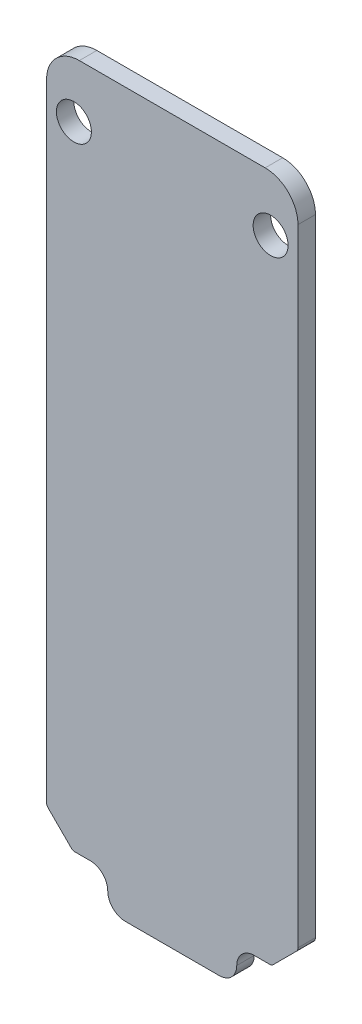
ISO-10303-21;
HEADER;
FILE_DESCRIPTION(('STEP AP214'),'2;1');
FILE_NAME('part.step','',(''),(''),'','','');
FILE_SCHEMA(('AUTOMOTIVE_DESIGN { 1 0 10303 214 1 1 1 1 }'));
ENDSEC;
DATA;
#1=APPLICATION_CONTEXT('core data for automotive mechanical design processes');
#2=APPLICATION_PROTOCOL_DEFINITION('international standard','automotive_design',2000,#1);
#3=PRODUCT_CONTEXT('',#1,'mechanical');
#4=PRODUCT('Part','Part','',(#3));
#5=PRODUCT_RELATED_PRODUCT_CATEGORY('part','',(#4));
#6=PRODUCT_DEFINITION_FORMATION('','',#4);
#7=PRODUCT_DEFINITION_CONTEXT('part definition',#1,'design');
#8=PRODUCT_DEFINITION('design','',#6,#7);
#9=PRODUCT_DEFINITION_SHAPE('','',#8);
#10=(LENGTH_UNIT() NAMED_UNIT(*) SI_UNIT(.MILLI.,.METRE.));
#11=(NAMED_UNIT(*) PLANE_ANGLE_UNIT() SI_UNIT($,.RADIAN.));
#12=(NAMED_UNIT(*) SI_UNIT($,.STERADIAN.) SOLID_ANGLE_UNIT());
#13=UNCERTAINTY_MEASURE_WITH_UNIT(LENGTH_MEASURE(1.E-05),#10,'distance_accuracy_value','');
#14=(GEOMETRIC_REPRESENTATION_CONTEXT(3) GLOBAL_UNCERTAINTY_ASSIGNED_CONTEXT((#13)) GLOBAL_UNIT_ASSIGNED_CONTEXT((#10,
#11,#12)) REPRESENTATION_CONTEXT('',''));
#15=CARTESIAN_POINT('',(0.,0.,0.));
#16=DIRECTION('',(0.,0.,1.));
#17=DIRECTION('',(1.,0.,0.));
#18=AXIS2_PLACEMENT_3D('',#15,#16,#17);
#19=CARTESIAN_POINT('',(-9.09999999999996,20.2,1.6));
#20=DIRECTION('',(0.707106781186547,0.707106781186548,0.));
#21=DIRECTION('',(-0.707106781186548,0.707106781186547,0.));
#22=AXIS2_PLACEMENT_3D('',#19,#20,#21);
#23=PLANE('',#22);
#24=DIRECTION('',(0.707106781186548,-0.707106781186547,0.));
#25=VECTOR('',#24,1.);
#26=CARTESIAN_POINT('',(-9.09999999999996,20.2,1.6));
#27=LINE('',#26,#25);
#28=CARTESIAN_POINT('',(-11.3535533905933,22.4535533905933,1.6));
#29=VERTEX_POINT('',#28);
#30=CARTESIAN_POINT('',(-9.24644660940669,20.3464466094067,1.6));
#31=VERTEX_POINT('',#30);
#32=EDGE_CURVE('E190',#29,#31,#27,.T.);
#33=ORIENTED_EDGE('',*,*,#32,.F.);
#34=DIRECTION('',(0.,0.,-1.));
#35=VECTOR('',#34,1.);
#36=CARTESIAN_POINT('',(-11.3535533905933,22.4535533905933,1.6));
#37=LINE('',#36,#35);
#38=CARTESIAN_POINT('',(-11.3535533905933,22.4535533905933,0.));
#39=VERTEX_POINT('',#38);
#40=EDGE_CURVE('E269',#29,#39,#37,.T.);
#41=ORIENTED_EDGE('',*,*,#40,.T.);
#42=DIRECTION('',(0.707106781186548,-0.707106781186547,0.));
#43=VECTOR('',#42,1.);
#44=CARTESIAN_POINT('',(-9.09999999999996,20.2,0.));
#45=LINE('',#44,#43);
#46=CARTESIAN_POINT('',(-9.24644660940669,20.3464466094067,0.));
#47=VERTEX_POINT('',#46);
#48=EDGE_CURVE('E239',#39,#47,#45,.T.);
#49=ORIENTED_EDGE('',*,*,#48,.T.);
#50=DIRECTION('',(0.,0.,-1.));
#51=VECTOR('',#50,1.);
#52=CARTESIAN_POINT('',(-9.24644660940669,20.3464466094067,1.6));
#53=LINE('',#52,#51);
#54=EDGE_CURVE('E49',#47,#31,#53,.F.);
#55=ORIENTED_EDGE('',*,*,#54,.T.);
#56=EDGE_LOOP('',(#33,#41,#49,#55));
#57=FACE_BOUND('',#56,.T.);
#58=ADVANCED_FACE('F34',(#57),#23,.F.);
#59=CARTESIAN_POINT('',(-9.09999999999996,20.2,1.6));
#60=DIRECTION('',(0.,1.,0.));
#61=DIRECTION('',(0.,0.,1.));
#62=AXIS2_PLACEMENT_3D('',#59,#60,#61);
#63=PLANE('',#62);
#64=DIRECTION('',(1.,0.,0.));
#65=VECTOR('',#64,1.);
#66=CARTESIAN_POINT('',(-9.09999999999996,20.2,1.6));
#67=LINE('',#66,#65);
#68=CARTESIAN_POINT('',(-8.89289321881341,20.2,1.6));
#69=VERTEX_POINT('',#68);
#70=CARTESIAN_POINT('',(-7.5,20.2,1.6));
#71=VERTEX_POINT('',#70);
#72=EDGE_CURVE('E320',#69,#71,#67,.T.);
#73=ORIENTED_EDGE('',*,*,#72,.F.);
#74=DIRECTION('',(0.,0.,-1.));
#75=VECTOR('',#74,1.);
#76=CARTESIAN_POINT('',(-8.89289321881341,20.2,1.6));
#77=LINE('',#76,#75);
#78=CARTESIAN_POINT('',(-8.89289321881341,20.2,0.));
#79=VERTEX_POINT('',#78);
#80=EDGE_CURVE('E11',#69,#79,#77,.T.);
#81=ORIENTED_EDGE('',*,*,#80,.T.);
#82=DIRECTION('',(1.,0.,0.));
#83=VECTOR('',#82,1.);
#84=CARTESIAN_POINT('',(-9.09999999999996,20.2,0.));
#85=LINE('',#84,#83);
#86=CARTESIAN_POINT('',(-7.5,20.2,0.));
#87=VERTEX_POINT('',#86);
#88=EDGE_CURVE('E285',#79,#87,#85,.T.);
#89=ORIENTED_EDGE('',*,*,#88,.T.);
#90=DIRECTION('',(0.,0.,-1.));
#91=VECTOR('',#90,1.);
#92=CARTESIAN_POINT('',(-7.5,20.2,1.6));
#93=LINE('',#92,#91);
#94=EDGE_CURVE('E223',#87,#71,#93,.F.);
#95=ORIENTED_EDGE('',*,*,#94,.T.);
#96=EDGE_LOOP('',(#73,#81,#89,#95));
#97=FACE_BOUND('',#96,.T.);
#98=ADVANCED_FACE('F355',(#97),#63,.F.);
#99=CARTESIAN_POINT('',(5.90000000000001,17.,1.6));
#100=DIRECTION('',(0.,1.,0.));
#101=DIRECTION('',(0.,0.,1.));
#102=AXIS2_PLACEMENT_3D('',#99,#100,#101);
#103=PLANE('',#102);
#104=DIRECTION('',(1.,0.,0.));
#105=VECTOR('',#104,1.);
#106=CARTESIAN_POINT('',(5.90000000000001,17.,1.6));
#107=LINE('',#106,#105);
#108=CARTESIAN_POINT('',(-4.3,17.,1.6));
#109=VERTEX_POINT('',#108);
#110=CARTESIAN_POINT('',(4.30000000000001,17.,1.6));
#111=VERTEX_POINT('',#110);
#112=EDGE_CURVE('E317',#109,#111,#107,.T.);
#113=ORIENTED_EDGE('',*,*,#112,.F.);
#114=DIRECTION('',(0.,0.,-1.));
#115=VECTOR('',#114,1.);
#116=CARTESIAN_POINT('',(-4.3,17.,1.6));
#117=LINE('',#116,#115);
#118=CARTESIAN_POINT('',(-4.3,17.,0.));
#119=VERTEX_POINT('',#118);
#120=EDGE_CURVE('E210',#109,#119,#117,.T.);
#121=ORIENTED_EDGE('',*,*,#120,.T.);
#122=DIRECTION('',(1.,0.,0.));
#123=VECTOR('',#122,1.);
#124=CARTESIAN_POINT('',(5.90000000000001,17.,0.));
#125=LINE('',#124,#123);
#126=CARTESIAN_POINT('',(4.30000000000001,17.,0.));
#127=VERTEX_POINT('',#126);
#128=EDGE_CURVE('E287',#119,#127,#125,.T.);
#129=ORIENTED_EDGE('',*,*,#128,.T.);
#130=DIRECTION('',(0.,0.,-1.));
#131=VECTOR('',#130,1.);
#132=CARTESIAN_POINT('',(4.30000000000001,17.,1.6));
#133=LINE('',#132,#131);
#134=EDGE_CURVE('E207',#127,#111,#133,.F.);
#135=ORIENTED_EDGE('',*,*,#134,.T.);
#136=EDGE_LOOP('',(#113,#121,#129,#135));
#137=FACE_BOUND('',#136,.T.);
#138=ADVANCED_FACE('F360',(#137),#103,.F.);
#139=CARTESIAN_POINT('',(9.09999999999996,20.2,1.6));
#140=DIRECTION('',(0.,1.,0.));
#141=DIRECTION('',(-1.,0.,0.));
#142=AXIS2_PLACEMENT_3D('',#139,#140,#141);
#143=PLANE('',#142);
#144=DIRECTION('',(1.,0.,0.));
#145=VECTOR('',#144,1.);
#146=CARTESIAN_POINT('',(9.09999999999996,20.2,0.));
#147=LINE('',#146,#145);
#148=CARTESIAN_POINT('',(7.50000000000001,20.2,0.));
#149=VERTEX_POINT('',#148);
#150=CARTESIAN_POINT('',(8.89289321881342,20.2,0.));
#151=VERTEX_POINT('',#150);
#152=EDGE_CURVE('E293',#149,#151,#147,.T.);
#153=ORIENTED_EDGE('',*,*,#152,.T.);
#154=DIRECTION('',(0.,0.,-1.));
#155=VECTOR('',#154,1.);
#156=CARTESIAN_POINT('',(8.89289321881342,20.2,1.6));
#157=LINE('',#156,#155);
#158=CARTESIAN_POINT('',(8.89289321881342,20.2,1.6));
#159=VERTEX_POINT('',#158);
#160=EDGE_CURVE('E266',#151,#159,#157,.F.);
#161=ORIENTED_EDGE('',*,*,#160,.T.);
#162=DIRECTION('',(1.,0.,0.));
#163=VECTOR('',#162,1.);
#164=CARTESIAN_POINT('',(9.09999999999996,20.2,1.6));
#165=LINE('',#164,#163);
#166=CARTESIAN_POINT('',(7.50000000000001,20.2,1.6));
#167=VERTEX_POINT('',#166);
#168=EDGE_CURVE('E312',#167,#159,#165,.T.);
#169=ORIENTED_EDGE('',*,*,#168,.F.);
#170=DIRECTION('',(0.,0.,-1.));
#171=VECTOR('',#170,1.);
#172=CARTESIAN_POINT('',(7.50000000000001,20.2,0.));
#173=LINE('',#172,#171);
#174=EDGE_CURVE('E221',#167,#149,#173,.T.);
#175=ORIENTED_EDGE('',*,*,#174,.T.);
#176=EDGE_LOOP('',(#153,#161,#169,#175));
#177=FACE_BOUND('',#176,.T.);
#178=ADVANCED_FACE('F491',(#177),#143,.F.);
#179=CARTESIAN_POINT('',(9.09999999999996,20.2,1.6));
#180=DIRECTION('',(-0.707106781186547,0.707106781186548,0.));
#181=DIRECTION('',(-0.707106781186548,-0.707106781186547,0.));
#182=AXIS2_PLACEMENT_3D('',#179,#180,#181);
#183=PLANE('',#182);
#184=DIRECTION('',(0.707106781186548,0.707106781186547,0.));
#185=VECTOR('',#184,1.);
#186=CARTESIAN_POINT('',(9.09999999999996,20.2,0.));
#187=LINE('',#186,#185);
#188=CARTESIAN_POINT('',(9.24644660940669,20.3464466094067,0.));
#189=VERTEX_POINT('',#188);
#190=CARTESIAN_POINT('',(11.3535533905933,22.4535533905933,0.));
#191=VERTEX_POINT('',#190);
#192=EDGE_CURVE('E192',#189,#191,#187,.T.);
#193=ORIENTED_EDGE('',*,*,#192,.T.);
#194=DIRECTION('',(0.,0.,-1.));
#195=VECTOR('',#194,1.);
#196=CARTESIAN_POINT('',(11.3535533905933,22.4535533905933,1.6));
#197=LINE('',#196,#195);
#198=CARTESIAN_POINT('',(11.3535533905933,22.4535533905933,1.6));
#199=VERTEX_POINT('',#198);
#200=EDGE_CURVE('E257',#191,#199,#197,.F.);
#201=ORIENTED_EDGE('',*,*,#200,.T.);
#202=DIRECTION('',(0.707106781186548,0.707106781186547,0.));
#203=VECTOR('',#202,1.);
#204=CARTESIAN_POINT('',(9.09999999999996,20.2,1.6));
#205=LINE('',#204,#203);
#206=CARTESIAN_POINT('',(9.24644660940669,20.3464466094067,1.6));
#207=VERTEX_POINT('',#206);
#208=EDGE_CURVE('E308',#207,#199,#205,.T.);
#209=ORIENTED_EDGE('',*,*,#208,.F.);
#210=DIRECTION('',(0.,0.,-1.));
#211=VECTOR('',#210,1.);
#212=CARTESIAN_POINT('',(9.24644660940669,20.3464466094067,1.6));
#213=LINE('',#212,#211);
#214=EDGE_CURVE('E254',#207,#189,#213,.T.);
#215=ORIENTED_EDGE('',*,*,#214,.T.);
#216=EDGE_LOOP('',(#193,#201,#209,#215));
#217=FACE_BOUND('',#216,.T.);
#218=ADVANCED_FACE('F299',(#217),#183,.F.);
#219=CARTESIAN_POINT('',(11.5,83.1,1.6));
#220=DIRECTION('',(-1.,0.,0.));
#221=DIRECTION('',(0.,-1.,0.));
#222=AXIS2_PLACEMENT_3D('',#219,#220,#221);
#223=PLANE('',#222);
#224=DIRECTION('',(0.,1.,0.));
#225=VECTOR('',#224,1.);
#226=CARTESIAN_POINT('',(11.5,83.1,1.6));
#227=LINE('',#226,#225);
#228=CARTESIAN_POINT('',(11.5,22.8071067811866,1.6));
#229=VERTEX_POINT('',#228);
#230=CARTESIAN_POINT('',(11.5,80.1,1.6));
#231=VERTEX_POINT('',#230);
#232=EDGE_CURVE('E307',#229,#231,#227,.T.);
#233=ORIENTED_EDGE('',*,*,#232,.F.);
#234=DIRECTION('',(0.,0.,-1.));
#235=VECTOR('',#234,1.);
#236=CARTESIAN_POINT('',(11.5,22.8071067811866,1.6));
#237=LINE('',#236,#235);
#238=CARTESIAN_POINT('',(11.5,22.8071067811866,0.));
#239=VERTEX_POINT('',#238);
#240=EDGE_CURVE('E235',#229,#239,#237,.T.);
#241=ORIENTED_EDGE('',*,*,#240,.T.);
#242=DIRECTION('',(0.,1.,0.));
#243=VECTOR('',#242,1.);
#244=CARTESIAN_POINT('',(11.5,83.1,0.));
#245=LINE('',#244,#243);
#246=CARTESIAN_POINT('',(11.5,80.1,0.));
#247=VERTEX_POINT('',#246);
#248=EDGE_CURVE('E187',#239,#247,#245,.T.);
#249=ORIENTED_EDGE('',*,*,#248,.T.);
#250=DIRECTION('',(0.,0.,-1.));
#251=VECTOR('',#250,1.);
#252=CARTESIAN_POINT('',(11.5,80.1,1.6));
#253=LINE('',#252,#251);
#254=EDGE_CURVE('E168',#247,#231,#253,.F.);
#255=ORIENTED_EDGE('',*,*,#254,.T.);
#256=EDGE_LOOP('',(#233,#241,#249,#255));
#257=FACE_BOUND('',#256,.T.);
#258=ADVANCED_FACE('F310',(#257),#223,.F.);
#259=CARTESIAN_POINT('',(11.5,83.1,1.6));
#260=DIRECTION('',(0.,-1.,0.));
#261=DIRECTION('',(0.,0.,-1.));
#262=AXIS2_PLACEMENT_3D('',#259,#260,#261);
#263=PLANE('',#262);
#264=DIRECTION('',(-1.,0.,0.));
#265=VECTOR('',#264,1.);
#266=CARTESIAN_POINT('',(11.5,83.1,1.6));
#267=LINE('',#266,#265);
#268=CARTESIAN_POINT('',(8.5,83.1,1.6));
#269=VERTEX_POINT('',#268);
#270=CARTESIAN_POINT('',(-8.5,83.1,1.6));
#271=VERTEX_POINT('',#270);
#272=EDGE_CURVE('E181',#269,#271,#267,.T.);
#273=ORIENTED_EDGE('',*,*,#272,.F.);
#274=DIRECTION('',(0.,0.,-1.));
#275=VECTOR('',#274,1.);
#276=CARTESIAN_POINT('',(8.5,83.1,1.6));
#277=LINE('',#276,#275);
#278=CARTESIAN_POINT('',(8.5,83.1,0.));
#279=VERTEX_POINT('',#278);
#280=EDGE_CURVE('E166',#269,#279,#277,.T.);
#281=ORIENTED_EDGE('',*,*,#280,.T.);
#282=DIRECTION('',(-1.,0.,0.));
#283=VECTOR('',#282,1.);
#284=CARTESIAN_POINT('',(11.5,83.1,0.));
#285=LINE('',#284,#283);
#286=CARTESIAN_POINT('',(-8.5,83.1,0.));
#287=VERTEX_POINT('',#286);
#288=EDGE_CURVE('E178',#279,#287,#285,.T.);
#289=ORIENTED_EDGE('',*,*,#288,.T.);
#290=DIRECTION('',(0.,0.,-1.));
#291=VECTOR('',#290,1.);
#292=CARTESIAN_POINT('',(-8.5,83.1,1.6));
#293=LINE('',#292,#291);
#294=EDGE_CURVE('E182',#287,#271,#293,.F.);
#295=ORIENTED_EDGE('',*,*,#294,.T.);
#296=EDGE_LOOP('',(#273,#281,#289,#295));
#297=FACE_BOUND('',#296,.T.);
#298=ADVANCED_FACE('F177',(#297),#263,.F.);
#299=CARTESIAN_POINT('',(-11.5,83.1,1.6));
#300=DIRECTION('',(1.,0.,0.));
#301=DIRECTION('',(0.,1.,0.));
#302=AXIS2_PLACEMENT_3D('',#299,#300,#301);
#303=PLANE('',#302);
#304=DIRECTION('',(0.,-1.,0.));
#305=VECTOR('',#304,1.);
#306=CARTESIAN_POINT('',(-11.5,83.1,0.));
#307=LINE('',#306,#305);
#308=CARTESIAN_POINT('',(-11.5,80.1,0.));
#309=VERTEX_POINT('',#308);
#310=CARTESIAN_POINT('',(-11.5,22.8071067811866,0.));
#311=VERTEX_POINT('',#310);
#312=EDGE_CURVE('E186',#309,#311,#307,.T.);
#313=ORIENTED_EDGE('',*,*,#312,.T.);
#314=DIRECTION('',(0.,0.,-1.));
#315=VECTOR('',#314,1.);
#316=CARTESIAN_POINT('',(-11.5,22.8071067811866,1.6));
#317=LINE('',#316,#315);
#318=CARTESIAN_POINT('',(-11.5,22.8071067811866,1.6));
#319=VERTEX_POINT('',#318);
#320=EDGE_CURVE('E42',#311,#319,#317,.F.);
#321=ORIENTED_EDGE('',*,*,#320,.T.);
#322=DIRECTION('',(0.,-1.,0.));
#323=VECTOR('',#322,1.);
#324=CARTESIAN_POINT('',(-11.5,83.1,1.6));
#325=LINE('',#324,#323);
#326=CARTESIAN_POINT('',(-11.5,80.1,1.6));
#327=VERTEX_POINT('',#326);
#328=EDGE_CURVE('E196',#327,#319,#325,.T.);
#329=ORIENTED_EDGE('',*,*,#328,.F.);
#330=DIRECTION('',(0.,0.,-1.));
#331=VECTOR('',#330,1.);
#332=CARTESIAN_POINT('',(-11.5,80.1,1.6));
#333=LINE('',#332,#331);
#334=EDGE_CURVE('E204',#327,#309,#333,.T.);
#335=ORIENTED_EDGE('',*,*,#334,.T.);
#336=EDGE_LOOP('',(#313,#321,#329,#335));
#337=FACE_BOUND('',#336,.T.);
#338=ADVANCED_FACE('F274',(#337),#303,.F.);
#339=CARTESIAN_POINT('',(0.,0.,1.6));
#340=DIRECTION('',(0.,0.,-1.));
#341=DIRECTION('',(-1.,0.,0.));
#342=AXIS2_PLACEMENT_3D('',#339,#340,#341);
#343=PLANE('',#342);
#344=CARTESIAN_POINT('',(-9.00000000000001,78.,1.6));
#345=DIRECTION('',(0.,0.,1.));
#346=DIRECTION('',(1.,0.,0.));
#347=AXIS2_PLACEMENT_3D('',#344,#345,#346);
#348=CIRCLE('',#347,1.6);
#349=CARTESIAN_POINT('',(-7.40000000000001,78.,1.6));
#350=VERTEX_POINT('',#349);
#351=EDGE_CURVE('E331',#350,#350,#348,.T.);
#352=ORIENTED_EDGE('',*,*,#351,.F.);
#353=EDGE_LOOP('',(#352));
#354=FACE_BOUND('',#353,.T.);
#355=CARTESIAN_POINT('',(9.00000000000001,78.,1.6));
#356=DIRECTION('',(0.,0.,1.));
#357=DIRECTION('',(1.,0.,0.));
#358=AXIS2_PLACEMENT_3D('',#355,#356,#357);
#359=CIRCLE('',#358,1.6);
#360=CARTESIAN_POINT('',(10.6,78.,1.6));
#361=VERTEX_POINT('',#360);
#362=EDGE_CURVE('E325',#361,#361,#359,.T.);
#363=ORIENTED_EDGE('',*,*,#362,.F.);
#364=EDGE_LOOP('',(#363));
#365=FACE_BOUND('',#364,.T.);
#366=ORIENTED_EDGE('',*,*,#208,.T.);
#367=CARTESIAN_POINT('',(11.,22.8071067811866,1.6));
#368=DIRECTION('',(0.,0.,-1.));
#369=DIRECTION('',(-1.,0.,0.));
#370=AXIS2_PLACEMENT_3D('',#367,#368,#369);
#371=CIRCLE('',#370,0.5);
#372=EDGE_CURVE('E264',#199,#229,#371,.F.);
#373=ORIENTED_EDGE('',*,*,#372,.T.);
#374=ORIENTED_EDGE('',*,*,#232,.T.);
#375=CARTESIAN_POINT('',(8.5,80.1,1.6));
#376=DIRECTION('',(0.,0.,-1.));
#377=DIRECTION('',(-1.,0.,0.));
#378=AXIS2_PLACEMENT_3D('',#375,#376,#377);
#379=CIRCLE('',#378,3.);
#380=EDGE_CURVE('E202',#231,#269,#379,.F.);
#381=ORIENTED_EDGE('',*,*,#380,.T.);
#382=ORIENTED_EDGE('',*,*,#272,.T.);
#383=CARTESIAN_POINT('',(-8.5,80.1,1.6));
#384=DIRECTION('',(0.,0.,-1.));
#385=DIRECTION('',(-1.,0.,0.));
#386=AXIS2_PLACEMENT_3D('',#383,#384,#385);
#387=CIRCLE('',#386,3.);
#388=EDGE_CURVE('E200',#271,#327,#387,.F.);
#389=ORIENTED_EDGE('',*,*,#388,.T.);
#390=ORIENTED_EDGE('',*,*,#328,.T.);
#391=CARTESIAN_POINT('',(-11.,22.8071067811866,1.6));
#392=DIRECTION('',(0.,0.,-1.));
#393=DIRECTION('',(-1.,0.,0.));
#394=AXIS2_PLACEMENT_3D('',#391,#392,#393);
#395=CIRCLE('',#394,0.5);
#396=EDGE_CURVE('E56',#319,#29,#395,.F.);
#397=ORIENTED_EDGE('',*,*,#396,.T.);
#398=ORIENTED_EDGE('',*,*,#32,.T.);
#399=CARTESIAN_POINT('',(-8.89289321881341,20.7,1.6));
#400=DIRECTION('',(0.,0.,-1.));
#401=DIRECTION('',(-1.,0.,0.));
#402=AXIS2_PLACEMENT_3D('',#399,#400,#401);
#403=CIRCLE('',#402,0.5);
#404=EDGE_CURVE('E259',#31,#69,#403,.F.);
#405=ORIENTED_EDGE('',*,*,#404,.T.);
#406=ORIENTED_EDGE('',*,*,#72,.T.);
#407=CARTESIAN_POINT('',(-7.5,18.6,1.6));
#408=DIRECTION('',(0.,0.,-1.));
#409=DIRECTION('',(-1.,0.,0.));
#410=AXIS2_PLACEMENT_3D('',#407,#408,#409);
#411=CIRCLE('',#410,1.6);
#412=CARTESIAN_POINT('',(-5.9,18.6000000000001,1.6));
#413=VERTEX_POINT('',#412);
#414=EDGE_CURVE('E233',#71,#413,#411,.T.);
#415=ORIENTED_EDGE('',*,*,#414,.T.);
#416=CARTESIAN_POINT('',(-4.3,18.6000000000001,1.6));
#417=DIRECTION('',(0.,0.,-1.));
#418=DIRECTION('',(-1.,0.,0.));
#419=AXIS2_PLACEMENT_3D('',#416,#417,#418);
#420=CIRCLE('',#419,1.6);
#421=EDGE_CURVE('E219',#413,#109,#420,.F.);
#422=ORIENTED_EDGE('',*,*,#421,.T.);
#423=ORIENTED_EDGE('',*,*,#112,.T.);
#424=CARTESIAN_POINT('',(4.30000000000001,18.6000000000001,1.6));
#425=DIRECTION('',(0.,0.,-1.));
#426=DIRECTION('',(-1.,0.,0.));
#427=AXIS2_PLACEMENT_3D('',#424,#425,#426);
#428=CIRCLE('',#427,1.6);
#429=CARTESIAN_POINT('',(5.90000000000001,18.6000000000001,1.6));
#430=VERTEX_POINT('',#429);
#431=EDGE_CURVE('E217',#111,#430,#428,.F.);
#432=ORIENTED_EDGE('',*,*,#431,.T.);
#433=CARTESIAN_POINT('',(7.50000000000001,18.6,1.6));
#434=DIRECTION('',(0.,0.,-1.));
#435=DIRECTION('',(-1.,0.,0.));
#436=AXIS2_PLACEMENT_3D('',#433,#434,#435);
#437=CIRCLE('',#436,1.6);
#438=EDGE_CURVE('E228',#430,#167,#437,.T.);
#439=ORIENTED_EDGE('',*,*,#438,.T.);
#440=ORIENTED_EDGE('',*,*,#168,.T.);
#441=CARTESIAN_POINT('',(8.89289321881342,20.7,1.6));
#442=DIRECTION('',(0.,0.,-1.));
#443=DIRECTION('',(-1.,0.,0.));
#444=AXIS2_PLACEMENT_3D('',#441,#442,#443);
#445=CIRCLE('',#444,0.5);
#446=EDGE_CURVE('E262',#159,#207,#445,.F.);
#447=ORIENTED_EDGE('',*,*,#446,.T.);
#448=EDGE_LOOP('',(#366,#373,#374,#381,#382,#389,#390,#397,#398,#405,#406,#415,#422,#423,#432,
#439,#440,#447));
#449=FACE_BOUND('',#448,.T.);
#450=ADVANCED_FACE('F278',(#354,#365,#449),#343,.F.);
#451=CARTESIAN_POINT('',(0.,0.,0.));
#452=DIRECTION('',(0.,0.,-1.));
#453=DIRECTION('',(-1.,0.,0.));
#454=AXIS2_PLACEMENT_3D('',#451,#452,#453);
#455=PLANE('',#454);
#456=CARTESIAN_POINT('',(-9.00000000000001,78.,0.));
#457=DIRECTION('',(0.,0.,1.));
#458=DIRECTION('',(1.,0.,0.));
#459=AXIS2_PLACEMENT_3D('',#456,#457,#458);
#460=CIRCLE('',#459,1.6);
#461=CARTESIAN_POINT('',(-7.40000000000001,78.,0.));
#462=VERTEX_POINT('',#461);
#463=EDGE_CURVE('E328',#462,#462,#460,.T.);
#464=ORIENTED_EDGE('',*,*,#463,.T.);
#465=EDGE_LOOP('',(#464));
#466=FACE_BOUND('',#465,.T.);
#467=CARTESIAN_POINT('',(9.00000000000001,78.,0.));
#468=DIRECTION('',(0.,0.,1.));
#469=DIRECTION('',(1.,0.,0.));
#470=AXIS2_PLACEMENT_3D('',#467,#468,#469);
#471=CIRCLE('',#470,1.6);
#472=CARTESIAN_POINT('',(10.6,78.,0.));
#473=VERTEX_POINT('',#472);
#474=EDGE_CURVE('E243',#473,#473,#471,.T.);
#475=ORIENTED_EDGE('',*,*,#474,.T.);
#476=EDGE_LOOP('',(#475));
#477=FACE_BOUND('',#476,.T.);
#478=ORIENTED_EDGE('',*,*,#248,.F.);
#479=CARTESIAN_POINT('',(11.,22.8071067811866,0.));
#480=DIRECTION('',(0.,0.,-1.));
#481=DIRECTION('',(-1.,0.,0.));
#482=AXIS2_PLACEMENT_3D('',#479,#480,#481);
#483=CIRCLE('',#482,0.5);
#484=EDGE_CURVE('E252',#239,#191,#483,.T.);
#485=ORIENTED_EDGE('',*,*,#484,.T.);
#486=ORIENTED_EDGE('',*,*,#192,.F.);
#487=CARTESIAN_POINT('',(8.89289321881342,20.7,0.));
#488=DIRECTION('',(0.,0.,-1.));
#489=DIRECTION('',(-1.,0.,0.));
#490=AXIS2_PLACEMENT_3D('',#487,#488,#489);
#491=CIRCLE('',#490,0.5);
#492=EDGE_CURVE('E250',#189,#151,#491,.T.);
#493=ORIENTED_EDGE('',*,*,#492,.T.);
#494=ORIENTED_EDGE('',*,*,#152,.F.);
#495=CARTESIAN_POINT('',(7.50000000000001,18.6,0.));
#496=DIRECTION('',(0.,0.,-1.));
#497=DIRECTION('',(-1.,0.,0.));
#498=AXIS2_PLACEMENT_3D('',#495,#496,#497);
#499=CIRCLE('',#498,1.6);
#500=CARTESIAN_POINT('',(5.90000000000001,18.6000000000001,0.));
#501=VERTEX_POINT('',#500);
#502=EDGE_CURVE('E226',#149,#501,#499,.F.);
#503=ORIENTED_EDGE('',*,*,#502,.T.);
#504=CARTESIAN_POINT('',(4.30000000000001,18.6000000000001,0.));
#505=DIRECTION('',(0.,0.,-1.));
#506=DIRECTION('',(-1.,0.,0.));
#507=AXIS2_PLACEMENT_3D('',#504,#505,#506);
#508=CIRCLE('',#507,1.6);
#509=EDGE_CURVE('E213',#501,#127,#508,.T.);
#510=ORIENTED_EDGE('',*,*,#509,.T.);
#511=ORIENTED_EDGE('',*,*,#128,.F.);
#512=CARTESIAN_POINT('',(-4.3,18.6000000000001,0.));
#513=DIRECTION('',(0.,0.,-1.));
#514=DIRECTION('',(-1.,0.,0.));
#515=AXIS2_PLACEMENT_3D('',#512,#513,#514);
#516=CIRCLE('',#515,1.6);
#517=CARTESIAN_POINT('',(-5.9,18.6000000000001,0.));
#518=VERTEX_POINT('',#517);
#519=EDGE_CURVE('E215',#119,#518,#516,.T.);
#520=ORIENTED_EDGE('',*,*,#519,.T.);
#521=CARTESIAN_POINT('',(-7.5,18.6,0.));
#522=DIRECTION('',(0.,0.,-1.));
#523=DIRECTION('',(-1.,0.,0.));
#524=AXIS2_PLACEMENT_3D('',#521,#522,#523);
#525=CIRCLE('',#524,1.6);
#526=EDGE_CURVE('E230',#518,#87,#525,.F.);
#527=ORIENTED_EDGE('',*,*,#526,.T.);
#528=ORIENTED_EDGE('',*,*,#88,.F.);
#529=CARTESIAN_POINT('',(-8.89289321881341,20.7,0.));
#530=DIRECTION('',(0.,0.,-1.));
#531=DIRECTION('',(-1.,0.,0.));
#532=AXIS2_PLACEMENT_3D('',#529,#530,#531);
#533=CIRCLE('',#532,0.5);
#534=EDGE_CURVE('E246',#79,#47,#533,.T.);
#535=ORIENTED_EDGE('',*,*,#534,.T.);
#536=ORIENTED_EDGE('',*,*,#48,.F.);
#537=CARTESIAN_POINT('',(-11.,22.8071067811866,0.));
#538=DIRECTION('',(0.,0.,-1.));
#539=DIRECTION('',(-1.,0.,0.));
#540=AXIS2_PLACEMENT_3D('',#537,#538,#539);
#541=CIRCLE('',#540,0.5);
#542=EDGE_CURVE('E248',#39,#311,#541,.T.);
#543=ORIENTED_EDGE('',*,*,#542,.T.);
#544=ORIENTED_EDGE('',*,*,#312,.F.);
#545=CARTESIAN_POINT('',(-8.5,80.1,0.));
#546=DIRECTION('',(0.,0.,-1.));
#547=DIRECTION('',(-1.,0.,0.));
#548=AXIS2_PLACEMENT_3D('',#545,#546,#547);
#549=CIRCLE('',#548,3.);
#550=EDGE_CURVE('E172',#309,#287,#549,.T.);
#551=ORIENTED_EDGE('',*,*,#550,.T.);
#552=ORIENTED_EDGE('',*,*,#288,.F.);
#553=CARTESIAN_POINT('',(8.5,80.1,0.));
#554=DIRECTION('',(0.,0.,-1.));
#555=DIRECTION('',(-1.,0.,0.));
#556=AXIS2_PLACEMENT_3D('',#553,#554,#555);
#557=CIRCLE('',#556,3.);
#558=EDGE_CURVE('E162',#279,#247,#557,.T.);
#559=ORIENTED_EDGE('',*,*,#558,.T.);
#560=EDGE_LOOP('',(#478,#485,#486,#493,#494,#503,#510,#511,#520,#527,#528,#535,#536,#543,#544,
#551,#552,#559));
#561=FACE_BOUND('',#560,.T.);
#562=ADVANCED_FACE('F184',(#466,#477,#561),#455,.T.);
#563=CARTESIAN_POINT('',(8.5,80.1,1.6));
#564=DIRECTION('',(0.,0.,-1.));
#565=DIRECTION('',(-1.,0.,0.));
#566=AXIS2_PLACEMENT_3D('',#563,#564,#565);
#567=CYLINDRICAL_SURFACE('',#566,3.);
#568=ORIENTED_EDGE('',*,*,#380,.F.);
#569=ORIENTED_EDGE('',*,*,#254,.F.);
#570=ORIENTED_EDGE('',*,*,#558,.F.);
#571=ORIENTED_EDGE('',*,*,#280,.F.);
#572=EDGE_LOOP('',(#568,#569,#570,#571));
#573=FACE_BOUND('',#572,.T.);
#574=ADVANCED_FACE('F165',(#573),#567,.T.);
#575=CARTESIAN_POINT('',(-8.5,80.1,1.6));
#576=DIRECTION('',(0.,0.,-1.));
#577=DIRECTION('',(-1.,0.,0.));
#578=AXIS2_PLACEMENT_3D('',#575,#576,#577);
#579=CYLINDRICAL_SURFACE('',#578,3.);
#580=ORIENTED_EDGE('',*,*,#388,.F.);
#581=ORIENTED_EDGE('',*,*,#294,.F.);
#582=ORIENTED_EDGE('',*,*,#550,.F.);
#583=ORIENTED_EDGE('',*,*,#334,.F.);
#584=EDGE_LOOP('',(#580,#581,#582,#583));
#585=FACE_BOUND('',#584,.T.);
#586=ADVANCED_FACE('F367',(#585),#579,.T.);
#587=CARTESIAN_POINT('',(-7.5,18.6,1.6));
#588=DIRECTION('',(0.,0.,1.));
#589=DIRECTION('',(1.,0.,0.));
#590=AXIS2_PLACEMENT_3D('',#587,#588,#589);
#591=CYLINDRICAL_SURFACE('',#590,1.6);
#592=DIRECTION('',(0.,0.,-1.));
#593=VECTOR('',#592,1.);
#594=CARTESIAN_POINT('',(-5.9,18.6,0.));
#595=LINE('',#594,#593);
#596=EDGE_CURVE('E236',#413,#518,#595,.T.);
#597=ORIENTED_EDGE('',*,*,#596,.F.);
#598=ORIENTED_EDGE('',*,*,#414,.F.);
#599=ORIENTED_EDGE('',*,*,#94,.F.);
#600=ORIENTED_EDGE('',*,*,#526,.F.);
#601=EDGE_LOOP('',(#597,#598,#599,#600));
#602=FACE_BOUND('',#601,.T.);
#603=ADVANCED_FACE('F370',(#602),#591,.F.);
#604=CARTESIAN_POINT('',(-4.3,18.6000000000001,1.6));
#605=DIRECTION('',(0.,0.,-1.));
#606=DIRECTION('',(-1.,0.,0.));
#607=AXIS2_PLACEMENT_3D('',#604,#605,#606);
#608=CYLINDRICAL_SURFACE('',#607,1.6);
#609=ORIENTED_EDGE('',*,*,#421,.F.);
#610=ORIENTED_EDGE('',*,*,#596,.T.);
#611=ORIENTED_EDGE('',*,*,#519,.F.);
#612=ORIENTED_EDGE('',*,*,#120,.F.);
#613=EDGE_LOOP('',(#609,#610,#611,#612));
#614=FACE_BOUND('',#613,.T.);
#615=ADVANCED_FACE('F372',(#614),#608,.T.);
#616=CARTESIAN_POINT('',(7.50000000000001,18.6,1.6));
#617=DIRECTION('',(0.,0.,1.));
#618=DIRECTION('',(1.,0.,0.));
#619=AXIS2_PLACEMENT_3D('',#616,#617,#618);
#620=CYLINDRICAL_SURFACE('',#619,1.6);
#621=ORIENTED_EDGE('',*,*,#174,.F.);
#622=ORIENTED_EDGE('',*,*,#438,.F.);
#623=DIRECTION('',(0.,0.,-1.));
#624=VECTOR('',#623,1.);
#625=CARTESIAN_POINT('',(5.90000000000001,18.6,1.6));
#626=LINE('',#625,#624);
#627=EDGE_CURVE('E240',#501,#430,#626,.F.);
#628=ORIENTED_EDGE('',*,*,#627,.F.);
#629=ORIENTED_EDGE('',*,*,#502,.F.);
#630=EDGE_LOOP('',(#621,#622,#628,#629));
#631=FACE_BOUND('',#630,.T.);
#632=ADVANCED_FACE('F375',(#631),#620,.F.);
#633=CARTESIAN_POINT('',(4.30000000000001,18.6000000000001,1.6));
#634=DIRECTION('',(0.,0.,-1.));
#635=DIRECTION('',(-1.,0.,0.));
#636=AXIS2_PLACEMENT_3D('',#633,#634,#635);
#637=CYLINDRICAL_SURFACE('',#636,1.6);
#638=ORIENTED_EDGE('',*,*,#431,.F.);
#639=ORIENTED_EDGE('',*,*,#134,.F.);
#640=ORIENTED_EDGE('',*,*,#509,.F.);
#641=ORIENTED_EDGE('',*,*,#627,.T.);
#642=EDGE_LOOP('',(#638,#639,#640,#641));
#643=FACE_BOUND('',#642,.T.);
#644=ADVANCED_FACE('F380',(#643),#637,.T.);
#645=CARTESIAN_POINT('',(11.,22.8071067811866,1.6));
#646=DIRECTION('',(0.,0.,-1.));
#647=DIRECTION('',(-1.,0.,0.));
#648=AXIS2_PLACEMENT_3D('',#645,#646,#647);
#649=CYLINDRICAL_SURFACE('',#648,0.5);
#650=ORIENTED_EDGE('',*,*,#372,.F.);
#651=ORIENTED_EDGE('',*,*,#200,.F.);
#652=ORIENTED_EDGE('',*,*,#484,.F.);
#653=ORIENTED_EDGE('',*,*,#240,.F.);
#654=EDGE_LOOP('',(#650,#651,#652,#653));
#655=FACE_BOUND('',#654,.T.);
#656=ADVANCED_FACE('F304',(#655),#649,.T.);
#657=CARTESIAN_POINT('',(8.89289321881342,20.7,1.6));
#658=DIRECTION('',(0.,0.,-1.));
#659=DIRECTION('',(-1.,0.,0.));
#660=AXIS2_PLACEMENT_3D('',#657,#658,#659);
#661=CYLINDRICAL_SURFACE('',#660,0.5);
#662=ORIENTED_EDGE('',*,*,#446,.F.);
#663=ORIENTED_EDGE('',*,*,#160,.F.);
#664=ORIENTED_EDGE('',*,*,#492,.F.);
#665=ORIENTED_EDGE('',*,*,#214,.F.);
#666=EDGE_LOOP('',(#662,#663,#664,#665));
#667=FACE_BOUND('',#666,.T.);
#668=ADVANCED_FACE('F389',(#667),#661,.T.);
#669=CARTESIAN_POINT('',(-11.,22.8071067811866,1.6));
#670=DIRECTION('',(0.,0.,-1.));
#671=DIRECTION('',(-1.,0.,0.));
#672=AXIS2_PLACEMENT_3D('',#669,#670,#671);
#673=CYLINDRICAL_SURFACE('',#672,0.5);
#674=ORIENTED_EDGE('',*,*,#396,.F.);
#675=ORIENTED_EDGE('',*,*,#320,.F.);
#676=ORIENTED_EDGE('',*,*,#542,.F.);
#677=ORIENTED_EDGE('',*,*,#40,.F.);
#678=EDGE_LOOP('',(#674,#675,#676,#677));
#679=FACE_BOUND('',#678,.T.);
#680=ADVANCED_FACE('F282',(#679),#673,.T.);
#681=CARTESIAN_POINT('',(-8.89289321881341,20.7,1.6));
#682=DIRECTION('',(0.,0.,-1.));
#683=DIRECTION('',(-1.,0.,0.));
#684=AXIS2_PLACEMENT_3D('',#681,#682,#683);
#685=CYLINDRICAL_SURFACE('',#684,0.5);
#686=ORIENTED_EDGE('',*,*,#404,.F.);
#687=ORIENTED_EDGE('',*,*,#54,.F.);
#688=ORIENTED_EDGE('',*,*,#534,.F.);
#689=ORIENTED_EDGE('',*,*,#80,.F.);
#690=EDGE_LOOP('',(#686,#687,#688,#689));
#691=FACE_BOUND('',#690,.T.);
#692=ADVANCED_FACE('F36',(#691),#685,.T.);
#693=CARTESIAN_POINT('',(9.00000000000001,78.,1.6));
#694=DIRECTION('',(0.,0.,1.));
#695=DIRECTION('',(1.,0.,0.));
#696=AXIS2_PLACEMENT_3D('',#693,#694,#695);
#697=CYLINDRICAL_SURFACE('',#696,1.6);
#698=ORIENTED_EDGE('',*,*,#474,.F.);
#699=EDGE_LOOP('',(#698));
#700=FACE_BOUND('',#699,.T.);
#701=ORIENTED_EDGE('',*,*,#362,.T.);
#702=EDGE_LOOP('',(#701));
#703=FACE_BOUND('',#702,.T.);
#704=ADVANCED_FACE('F342',(#700,#703),#697,.F.);
#705=CARTESIAN_POINT('',(-9.00000000000001,78.,1.6));
#706=DIRECTION('',(0.,0.,1.));
#707=DIRECTION('',(1.,0.,0.));
#708=AXIS2_PLACEMENT_3D('',#705,#706,#707);
#709=CYLINDRICAL_SURFACE('',#708,1.6);
#710=ORIENTED_EDGE('',*,*,#463,.F.);
#711=EDGE_LOOP('',(#710));
#712=FACE_BOUND('',#711,.T.);
#713=ORIENTED_EDGE('',*,*,#351,.T.);
#714=EDGE_LOOP('',(#713));
#715=FACE_BOUND('',#714,.T.);
#716=ADVANCED_FACE('F335',(#712,#715),#709,.F.);
#717=CLOSED_SHELL('',(#58,#98,#138,#178,#218,#258,#298,#338,#450,#562,#574,#586,#603,#615,#632,
#644,#656,#668,#680,#692,#704,#716));
#718=MANIFOLD_SOLID_BREP('B2',#717);
#719=ADVANCED_BREP_SHAPE_REPRESENTATION('',(#18,#718),#14);
#720=SHAPE_DEFINITION_REPRESENTATION(#9,#719);
ENDSEC;
END-ISO-10303-21;
